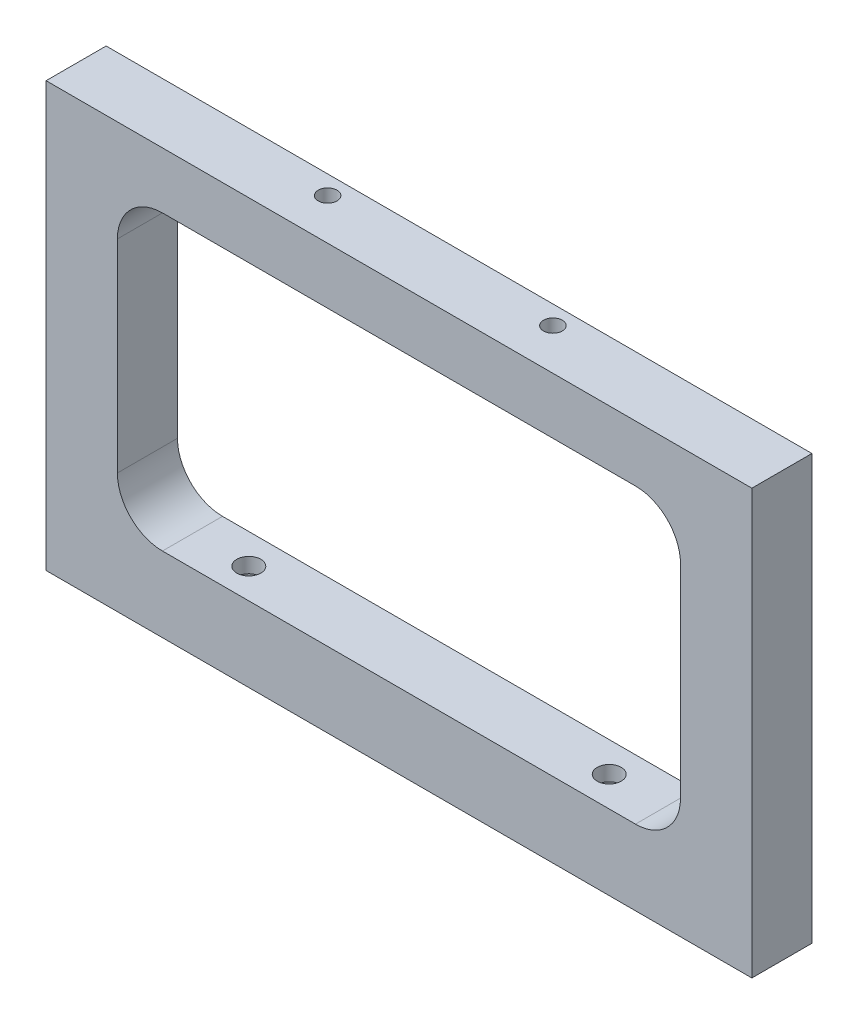
ISO-10303-21;
HEADER;
FILE_DESCRIPTION(('STEP AP214'),'2;1');
FILE_NAME('part.step','',(''),(''),'','','');
FILE_SCHEMA(('AUTOMOTIVE_DESIGN { 1 0 10303 214 1 1 1 1 }'));
ENDSEC;
DATA;
#1=APPLICATION_CONTEXT('core data for automotive mechanical design processes');
#2=APPLICATION_PROTOCOL_DEFINITION('international standard','automotive_design',2000,#1);
#3=PRODUCT_CONTEXT('',#1,'mechanical');
#4=PRODUCT('Part','Part','',(#3));
#5=PRODUCT_RELATED_PRODUCT_CATEGORY('part','',(#4));
#6=PRODUCT_DEFINITION_FORMATION('','',#4);
#7=PRODUCT_DEFINITION_CONTEXT('part definition',#1,'design');
#8=PRODUCT_DEFINITION('design','',#6,#7);
#9=PRODUCT_DEFINITION_SHAPE('','',#8);
#10=(LENGTH_UNIT() NAMED_UNIT(*) SI_UNIT(.MILLI.,.METRE.));
#11=(NAMED_UNIT(*) PLANE_ANGLE_UNIT() SI_UNIT($,.RADIAN.));
#12=(NAMED_UNIT(*) SI_UNIT($,.STERADIAN.) SOLID_ANGLE_UNIT());
#13=UNCERTAINTY_MEASURE_WITH_UNIT(LENGTH_MEASURE(1.E-05),#10,'distance_accuracy_value','');
#14=(GEOMETRIC_REPRESENTATION_CONTEXT(3) GLOBAL_UNCERTAINTY_ASSIGNED_CONTEXT((#13)) GLOBAL_UNIT_ASSIGNED_CONTEXT((#10,
#11,#12)) REPRESENTATION_CONTEXT('',''));
#15=CARTESIAN_POINT('',(0.,0.,0.));
#16=DIRECTION('',(0.,0.,1.));
#17=DIRECTION('',(1.,0.,0.));
#18=AXIS2_PLACEMENT_3D('',#15,#16,#17);
#19=CARTESIAN_POINT('',(0.,0.,0.));
#20=DIRECTION('',(0.,1.,0.));
#21=DIRECTION('',(1.,0.,0.));
#22=AXIS2_PLACEMENT_3D('',#19,#20,#21);
#23=PLANE('',#22);
#24=DIRECTION('',(-1.,0.,0.));
#25=VECTOR('',#24,1.);
#26=CARTESIAN_POINT('',(47.,0.,-4.));
#27=LINE('',#26,#25);
#28=CARTESIAN_POINT('',(47.,0.,-4.));
#29=VERTEX_POINT('',#28);
#30=CARTESIAN_POINT('',(-47.,0.,-4.));
#31=VERTEX_POINT('',#30);
#32=EDGE_CURVE('E213',#29,#31,#27,.T.);
#33=ORIENTED_EDGE('',*,*,#32,.F.);
#34=DIRECTION('',(0.,0.,-1.));
#35=VECTOR('',#34,1.);
#36=CARTESIAN_POINT('',(47.,0.,4.));
#37=LINE('',#36,#35);
#38=CARTESIAN_POINT('',(47.,0.,4.));
#39=VERTEX_POINT('',#38);
#40=EDGE_CURVE('E35',#39,#29,#37,.T.);
#41=ORIENTED_EDGE('',*,*,#40,.F.);
#42=DIRECTION('',(1.,0.,0.));
#43=VECTOR('',#42,1.);
#44=CARTESIAN_POINT('',(-47.,0.,4.));
#45=LINE('',#44,#43);
#46=CARTESIAN_POINT('',(-47.,0.,4.));
#47=VERTEX_POINT('',#46);
#48=EDGE_CURVE('E236',#47,#39,#45,.T.);
#49=ORIENTED_EDGE('',*,*,#48,.F.);
#50=DIRECTION('',(0.,0.,1.));
#51=VECTOR('',#50,1.);
#52=CARTESIAN_POINT('',(-47.,0.,-4.));
#53=LINE('',#52,#51);
#54=EDGE_CURVE('E26',#31,#47,#53,.T.);
#55=ORIENTED_EDGE('',*,*,#54,.F.);
#56=EDGE_LOOP('',(#33,#41,#49,#55));
#57=FACE_BOUND('',#56,.T.);
#58=CARTESIAN_POINT('',(24.,0.,0.));
#59=DIRECTION('',(0.,-1.,0.));
#60=DIRECTION('',(-1.,0.,0.));
#61=AXIS2_PLACEMENT_3D('',#58,#59,#60);
#62=CIRCLE('',#61,2.55);
#63=CARTESIAN_POINT('',(21.45,0.,0.));
#64=VERTEX_POINT('',#63);
#65=EDGE_CURVE('E176',#64,#64,#62,.T.);
#66=ORIENTED_EDGE('',*,*,#65,.F.);
#67=EDGE_LOOP('',(#66));
#68=FACE_BOUND('',#67,.T.);
#69=CARTESIAN_POINT('',(-24.,0.,0.));
#70=DIRECTION('',(0.,-1.,0.));
#71=DIRECTION('',(-1.,0.,0.));
#72=AXIS2_PLACEMENT_3D('',#69,#70,#71);
#73=CIRCLE('',#72,2.55);
#74=CARTESIAN_POINT('',(-26.55,0.,0.));
#75=VERTEX_POINT('',#74);
#76=EDGE_CURVE('E197',#75,#75,#73,.T.);
#77=ORIENTED_EDGE('',*,*,#76,.F.);
#78=EDGE_LOOP('',(#77));
#79=FACE_BOUND('',#78,.T.);
#80=ADVANCED_FACE('F16',(#57,#68,#79),#23,.F.);
#81=CARTESIAN_POINT('',(-47.,0.,-4.));
#82=DIRECTION('',(-1.,0.,0.));
#83=DIRECTION('',(0.,0.,1.));
#84=AXIS2_PLACEMENT_3D('',#81,#82,#83);
#85=PLANE('',#84);
#86=DIRECTION('',(0.,1.,0.));
#87=VECTOR('',#86,1.);
#88=CARTESIAN_POINT('',(-47.,0.,4.));
#89=LINE('',#88,#87);
#90=CARTESIAN_POINT('',(-47.,56.5,4.));
#91=VERTEX_POINT('',#90);
#92=EDGE_CURVE('E11',#47,#91,#89,.T.);
#93=ORIENTED_EDGE('',*,*,#92,.T.);
#94=DIRECTION('',(0.,0.,1.));
#95=VECTOR('',#94,1.);
#96=CARTESIAN_POINT('',(-47.,56.5,-4.));
#97=LINE('',#96,#95);
#98=CARTESIAN_POINT('',(-47.,56.5,-4.));
#99=VERTEX_POINT('',#98);
#100=EDGE_CURVE('E207',#99,#91,#97,.T.);
#101=ORIENTED_EDGE('',*,*,#100,.F.);
#102=DIRECTION('',(0.,1.,0.));
#103=VECTOR('',#102,1.);
#104=CARTESIAN_POINT('',(-47.,0.,-4.));
#105=LINE('',#104,#103);
#106=EDGE_CURVE('E210',#31,#99,#105,.T.);
#107=ORIENTED_EDGE('',*,*,#106,.F.);
#108=ORIENTED_EDGE('',*,*,#54,.T.);
#109=EDGE_LOOP('',(#93,#101,#107,#108));
#110=FACE_BOUND('',#109,.T.);
#111=ADVANCED_FACE('F274',(#110),#85,.T.);
#112=CARTESIAN_POINT('',(47.,0.,-4.));
#113=DIRECTION('',(0.,0.,-1.));
#114=DIRECTION('',(-1.,0.,0.));
#115=AXIS2_PLACEMENT_3D('',#112,#113,#114);
#116=PLANE('',#115);
#117=ORIENTED_EDGE('',*,*,#106,.T.);
#118=DIRECTION('',(-1.,0.,0.));
#119=VECTOR('',#118,1.);
#120=CARTESIAN_POINT('',(47.,56.5,-4.));
#121=LINE('',#120,#119);
#122=CARTESIAN_POINT('',(47.,56.5,-4.));
#123=VERTEX_POINT('',#122);
#124=EDGE_CURVE('E209',#123,#99,#121,.T.);
#125=ORIENTED_EDGE('',*,*,#124,.F.);
#126=DIRECTION('',(0.,1.,0.));
#127=VECTOR('',#126,1.);
#128=CARTESIAN_POINT('',(47.,0.,-4.));
#129=LINE('',#128,#127);
#130=EDGE_CURVE('E217',#29,#123,#129,.T.);
#131=ORIENTED_EDGE('',*,*,#130,.F.);
#132=ORIENTED_EDGE('',*,*,#32,.T.);
#133=EDGE_LOOP('',(#117,#125,#131,#132));
#134=FACE_BOUND('',#133,.T.);
#135=DIRECTION('',(1.,0.,0.));
#136=VECTOR('',#135,1.);
#137=CARTESIAN_POINT('',(-31.5,49.,-4.));
#138=LINE('',#137,#136);
#139=CARTESIAN_POINT('',(-31.5,49.,-4.));
#140=VERTEX_POINT('',#139);
#141=CARTESIAN_POINT('',(31.5,49.,-4.));
#142=VERTEX_POINT('',#141);
#143=EDGE_CURVE('E131',#140,#142,#138,.T.);
#144=ORIENTED_EDGE('',*,*,#143,.F.);
#145=CARTESIAN_POINT('',(-31.5,43.,-4.));
#146=DIRECTION('',(0.,0.,-1.));
#147=DIRECTION('',(-1.,0.,0.));
#148=AXIS2_PLACEMENT_3D('',#145,#146,#147);
#149=CIRCLE('',#148,6.);
#150=CARTESIAN_POINT('',(-37.5,43.,-4.));
#151=VERTEX_POINT('',#150);
#152=EDGE_CURVE('E172',#151,#140,#149,.T.);
#153=ORIENTED_EDGE('',*,*,#152,.F.);
#154=DIRECTION('',(0.,1.,0.));
#155=VECTOR('',#154,1.);
#156=CARTESIAN_POINT('',(-37.5,16.,-4.));
#157=LINE('',#156,#155);
#158=CARTESIAN_POINT('',(-37.5,16.,-4.));
#159=VERTEX_POINT('',#158);
#160=EDGE_CURVE('E168',#159,#151,#157,.T.);
#161=ORIENTED_EDGE('',*,*,#160,.F.);
#162=CARTESIAN_POINT('',(-31.5,16.,-4.));
#163=DIRECTION('',(0.,0.,-1.));
#164=DIRECTION('',(0.,-1.,0.));
#165=AXIS2_PLACEMENT_3D('',#162,#163,#164);
#166=CIRCLE('',#165,6.);
#167=CARTESIAN_POINT('',(-31.5,10.,-4.));
#168=VERTEX_POINT('',#167);
#169=EDGE_CURVE('E164',#168,#159,#166,.T.);
#170=ORIENTED_EDGE('',*,*,#169,.F.);
#171=DIRECTION('',(-1.,0.,0.));
#172=VECTOR('',#171,1.);
#173=CARTESIAN_POINT('',(31.5,10.,-4.));
#174=LINE('',#173,#172);
#175=CARTESIAN_POINT('',(31.5,10.,-4.));
#176=VERTEX_POINT('',#175);
#177=EDGE_CURVE('E154',#176,#168,#174,.T.);
#178=ORIENTED_EDGE('',*,*,#177,.F.);
#179=CARTESIAN_POINT('',(31.5,16.,-4.));
#180=DIRECTION('',(0.,0.,-1.));
#181=DIRECTION('',(1.,0.,0.));
#182=AXIS2_PLACEMENT_3D('',#179,#180,#181);
#183=CIRCLE('',#182,6.);
#184=CARTESIAN_POINT('',(37.5,16.,-4.));
#185=VERTEX_POINT('',#184);
#186=EDGE_CURVE('E150',#185,#176,#183,.T.);
#187=ORIENTED_EDGE('',*,*,#186,.F.);
#188=DIRECTION('',(0.,-1.,0.));
#189=VECTOR('',#188,1.);
#190=CARTESIAN_POINT('',(37.5,43.,-4.));
#191=LINE('',#190,#189);
#192=CARTESIAN_POINT('',(37.5,43.,-4.));
#193=VERTEX_POINT('',#192);
#194=EDGE_CURVE('E146',#193,#185,#191,.T.);
#195=ORIENTED_EDGE('',*,*,#194,.F.);
#196=CARTESIAN_POINT('',(31.5,43.,-4.));
#197=DIRECTION('',(0.,0.,-1.));
#198=DIRECTION('',(0.,1.,0.));
#199=AXIS2_PLACEMENT_3D('',#196,#197,#198);
#200=CIRCLE('',#199,6.);
#201=EDGE_CURVE('E144',#142,#193,#200,.T.);
#202=ORIENTED_EDGE('',*,*,#201,.F.);
#203=EDGE_LOOP('',(#144,#153,#161,#170,#178,#187,#195,#202));
#204=FACE_BOUND('',#203,.T.);
#205=ADVANCED_FACE('F280',(#134,#204),#116,.T.);
#206=CARTESIAN_POINT('',(47.,0.,4.));
#207=DIRECTION('',(1.,0.,0.));
#208=DIRECTION('',(0.,0.,-1.));
#209=AXIS2_PLACEMENT_3D('',#206,#207,#208);
#210=PLANE('',#209);
#211=ORIENTED_EDGE('',*,*,#130,.T.);
#212=DIRECTION('',(0.,0.,-1.));
#213=VECTOR('',#212,1.);
#214=CARTESIAN_POINT('',(47.,56.5,4.));
#215=LINE('',#214,#213);
#216=CARTESIAN_POINT('',(47.,56.5,4.));
#217=VERTEX_POINT('',#216);
#218=EDGE_CURVE('E216',#217,#123,#215,.T.);
#219=ORIENTED_EDGE('',*,*,#218,.F.);
#220=DIRECTION('',(0.,1.,0.));
#221=VECTOR('',#220,1.);
#222=CARTESIAN_POINT('',(47.,0.,4.));
#223=LINE('',#222,#221);
#224=EDGE_CURVE('E233',#39,#217,#223,.T.);
#225=ORIENTED_EDGE('',*,*,#224,.F.);
#226=ORIENTED_EDGE('',*,*,#40,.T.);
#227=EDGE_LOOP('',(#211,#219,#225,#226));
#228=FACE_BOUND('',#227,.T.);
#229=ADVANCED_FACE('F287',(#228),#210,.T.);
#230=CARTESIAN_POINT('',(-47.,0.,4.));
#231=DIRECTION('',(0.,0.,1.));
#232=DIRECTION('',(1.,0.,0.));
#233=AXIS2_PLACEMENT_3D('',#230,#231,#232);
#234=PLANE('',#233);
#235=ORIENTED_EDGE('',*,*,#224,.T.);
#236=DIRECTION('',(1.,0.,0.));
#237=VECTOR('',#236,1.);
#238=CARTESIAN_POINT('',(-47.,56.5,4.));
#239=LINE('',#238,#237);
#240=EDGE_CURVE('E120',#91,#217,#239,.T.);
#241=ORIENTED_EDGE('',*,*,#240,.F.);
#242=ORIENTED_EDGE('',*,*,#92,.F.);
#243=ORIENTED_EDGE('',*,*,#48,.T.);
#244=EDGE_LOOP('',(#235,#241,#242,#243));
#245=FACE_BOUND('',#244,.T.);
#246=DIRECTION('',(0.,-1.,0.));
#247=VECTOR('',#246,1.);
#248=CARTESIAN_POINT('',(37.5,43.,4.));
#249=LINE('',#248,#247);
#250=CARTESIAN_POINT('',(37.5,43.,4.));
#251=VERTEX_POINT('',#250);
#252=CARTESIAN_POINT('',(37.5,16.,4.));
#253=VERTEX_POINT('',#252);
#254=EDGE_CURVE('E239',#251,#253,#249,.T.);
#255=ORIENTED_EDGE('',*,*,#254,.T.);
#256=CARTESIAN_POINT('',(31.5,16.,4.));
#257=DIRECTION('',(0.,0.,-1.));
#258=DIRECTION('',(1.,0.,0.));
#259=AXIS2_PLACEMENT_3D('',#256,#257,#258);
#260=CIRCLE('',#259,6.);
#261=CARTESIAN_POINT('',(31.5,10.,4.));
#262=VERTEX_POINT('',#261);
#263=EDGE_CURVE('E241',#253,#262,#260,.T.);
#264=ORIENTED_EDGE('',*,*,#263,.T.);
#265=DIRECTION('',(-1.,0.,0.));
#266=VECTOR('',#265,1.);
#267=CARTESIAN_POINT('',(31.5,10.,4.));
#268=LINE('',#267,#266);
#269=CARTESIAN_POINT('',(-31.5,10.,4.));
#270=VERTEX_POINT('',#269);
#271=EDGE_CURVE('E244',#262,#270,#268,.T.);
#272=ORIENTED_EDGE('',*,*,#271,.T.);
#273=CARTESIAN_POINT('',(-31.5,16.,4.));
#274=DIRECTION('',(0.,0.,-1.));
#275=DIRECTION('',(0.,-1.,0.));
#276=AXIS2_PLACEMENT_3D('',#273,#274,#275);
#277=CIRCLE('',#276,6.);
#278=CARTESIAN_POINT('',(-37.5,16.,4.));
#279=VERTEX_POINT('',#278);
#280=EDGE_CURVE('E247',#270,#279,#277,.T.);
#281=ORIENTED_EDGE('',*,*,#280,.T.);
#282=DIRECTION('',(0.,1.,0.));
#283=VECTOR('',#282,1.);
#284=CARTESIAN_POINT('',(-37.5,16.,4.));
#285=LINE('',#284,#283);
#286=CARTESIAN_POINT('',(-37.5,43.,4.));
#287=VERTEX_POINT('',#286);
#288=EDGE_CURVE('E250',#279,#287,#285,.T.);
#289=ORIENTED_EDGE('',*,*,#288,.T.);
#290=CARTESIAN_POINT('',(-31.5,43.,4.));
#291=DIRECTION('',(0.,0.,-1.));
#292=DIRECTION('',(-1.,0.,0.));
#293=AXIS2_PLACEMENT_3D('',#290,#291,#292);
#294=CIRCLE('',#293,6.);
#295=CARTESIAN_POINT('',(-31.5,49.,4.));
#296=VERTEX_POINT('',#295);
#297=EDGE_CURVE('E124',#287,#296,#294,.T.);
#298=ORIENTED_EDGE('',*,*,#297,.T.);
#299=DIRECTION('',(1.,0.,0.));
#300=VECTOR('',#299,1.);
#301=CARTESIAN_POINT('',(-31.5,49.,4.));
#302=LINE('',#301,#300);
#303=CARTESIAN_POINT('',(31.5,49.,4.));
#304=VERTEX_POINT('',#303);
#305=EDGE_CURVE('E105',#296,#304,#302,.T.);
#306=ORIENTED_EDGE('',*,*,#305,.T.);
#307=CARTESIAN_POINT('',(31.5,43.,4.));
#308=DIRECTION('',(0.,0.,-1.));
#309=DIRECTION('',(0.,1.,0.));
#310=AXIS2_PLACEMENT_3D('',#307,#308,#309);
#311=CIRCLE('',#310,6.);
#312=EDGE_CURVE('E111',#304,#251,#311,.T.);
#313=ORIENTED_EDGE('',*,*,#312,.T.);
#314=EDGE_LOOP('',(#255,#264,#272,#281,#289,#298,#306,#313));
#315=FACE_BOUND('',#314,.T.);
#316=ADVANCED_FACE('F122',(#245,#315),#234,.T.);
#317=CARTESIAN_POINT('',(0.,56.5,0.));
#318=DIRECTION('',(0.,1.,0.));
#319=DIRECTION('',(1.,0.,0.));
#320=AXIS2_PLACEMENT_3D('',#317,#318,#319);
#321=PLANE('',#320);
#322=ORIENTED_EDGE('',*,*,#240,.T.);
#323=ORIENTED_EDGE('',*,*,#218,.T.);
#324=ORIENTED_EDGE('',*,*,#124,.T.);
#325=ORIENTED_EDGE('',*,*,#100,.T.);
#326=EDGE_LOOP('',(#322,#323,#324,#325));
#327=FACE_BOUND('',#326,.T.);
#328=CARTESIAN_POINT('',(-15.,56.5,-1.5));
#329=DIRECTION('',(0.,1.,0.));
#330=DIRECTION('',(-1.,0.,0.));
#331=AXIS2_PLACEMENT_3D('',#328,#329,#330);
#332=CIRCLE('',#331,1.25);
#333=CARTESIAN_POINT('',(-16.25,56.5,-1.5));
#334=VERTEX_POINT('',#333);
#335=EDGE_CURVE('E134',#334,#334,#332,.T.);
#336=ORIENTED_EDGE('',*,*,#335,.F.);
#337=EDGE_LOOP('',(#336));
#338=FACE_BOUND('',#337,.T.);
#339=CARTESIAN_POINT('',(15.,56.5,-1.5));
#340=DIRECTION('',(0.,1.,0.));
#341=DIRECTION('',(-1.,0.,0.));
#342=AXIS2_PLACEMENT_3D('',#339,#340,#341);
#343=CIRCLE('',#342,1.25);
#344=CARTESIAN_POINT('',(13.75,56.5,-1.5));
#345=VERTEX_POINT('',#344);
#346=EDGE_CURVE('E199',#345,#345,#343,.T.);
#347=ORIENTED_EDGE('',*,*,#346,.F.);
#348=EDGE_LOOP('',(#347));
#349=FACE_BOUND('',#348,.T.);
#350=ADVANCED_FACE('F258',(#327,#338,#349),#321,.T.);
#351=CARTESIAN_POINT('',(-15.,62.8075,-1.5));
#352=DIRECTION('',(0.,-1.,0.));
#353=DIRECTION('',(-1.,0.,0.));
#354=AXIS2_PLACEMENT_3D('',#351,#352,#353);
#355=CYLINDRICAL_SURFACE('',#354,1.25);
#356=CARTESIAN_POINT('',(-15.,49.,-1.5));
#357=DIRECTION('',(0.,1.,0.));
#358=DIRECTION('',(1.,0.,0.));
#359=AXIS2_PLACEMENT_3D('',#356,#357,#358);
#360=CIRCLE('',#359,1.25);
#361=CARTESIAN_POINT('',(-13.75,49.,-1.5));
#362=VERTEX_POINT('',#361);
#363=EDGE_CURVE('E132',#362,#362,#360,.T.);
#364=ORIENTED_EDGE('',*,*,#363,.F.);
#365=EDGE_LOOP('',(#364));
#366=FACE_BOUND('',#365,.T.);
#367=ORIENTED_EDGE('',*,*,#335,.T.);
#368=EDGE_LOOP('',(#367));
#369=FACE_BOUND('',#368,.T.);
#370=ADVANCED_FACE('F256',(#366,#369),#355,.F.);
#371=CARTESIAN_POINT('',(-31.5,49.,-4.));
#372=DIRECTION('',(0.,1.,0.));
#373=DIRECTION('',(1.,0.,0.));
#374=AXIS2_PLACEMENT_3D('',#371,#372,#373);
#375=PLANE('',#374);
#376=DIRECTION('',(0.,0.,1.));
#377=VECTOR('',#376,1.);
#378=CARTESIAN_POINT('',(-31.5,49.,-4.));
#379=LINE('',#378,#377);
#380=EDGE_CURVE('E141',#140,#296,#379,.T.);
#381=ORIENTED_EDGE('',*,*,#380,.F.);
#382=ORIENTED_EDGE('',*,*,#143,.T.);
#383=DIRECTION('',(0.,0.,1.));
#384=VECTOR('',#383,1.);
#385=CARTESIAN_POINT('',(31.5,49.,-4.));
#386=LINE('',#385,#384);
#387=EDGE_CURVE('E114',#142,#304,#386,.T.);
#388=ORIENTED_EDGE('',*,*,#387,.T.);
#389=ORIENTED_EDGE('',*,*,#305,.F.);
#390=EDGE_LOOP('',(#381,#382,#388,#389));
#391=FACE_BOUND('',#390,.T.);
#392=ORIENTED_EDGE('',*,*,#363,.T.);
#393=EDGE_LOOP('',(#392));
#394=FACE_BOUND('',#393,.T.);
#395=CARTESIAN_POINT('',(15.,49.,-1.5));
#396=DIRECTION('',(0.,1.,0.));
#397=DIRECTION('',(-1.,0.,0.));
#398=AXIS2_PLACEMENT_3D('',#395,#396,#397);
#399=CIRCLE('',#398,1.25);
#400=CARTESIAN_POINT('',(13.75,49.,-1.5));
#401=VERTEX_POINT('',#400);
#402=EDGE_CURVE('E137',#401,#401,#399,.T.);
#403=ORIENTED_EDGE('',*,*,#402,.T.);
#404=EDGE_LOOP('',(#403));
#405=FACE_BOUND('',#404,.T.);
#406=ADVANCED_FACE('F128',(#391,#394,#405),#375,.F.);
#407=CARTESIAN_POINT('',(31.5,43.,-4.));
#408=DIRECTION('',(0.,0.,-1.));
#409=DIRECTION('',(-1.,0.,0.));
#410=AXIS2_PLACEMENT_3D('',#407,#408,#409);
#411=CYLINDRICAL_SURFACE('',#410,6.);
#412=ORIENTED_EDGE('',*,*,#387,.F.);
#413=ORIENTED_EDGE('',*,*,#201,.T.);
#414=DIRECTION('',(0.,0.,1.));
#415=VECTOR('',#414,1.);
#416=CARTESIAN_POINT('',(37.5,43.,-4.));
#417=LINE('',#416,#415);
#418=EDGE_CURVE('E116',#193,#251,#417,.T.);
#419=ORIENTED_EDGE('',*,*,#418,.T.);
#420=ORIENTED_EDGE('',*,*,#312,.F.);
#421=EDGE_LOOP('',(#412,#413,#419,#420));
#422=FACE_BOUND('',#421,.T.);
#423=ADVANCED_FACE('F112',(#422),#411,.F.);
#424=CARTESIAN_POINT('',(37.5,43.,-4.));
#425=DIRECTION('',(1.,0.,0.));
#426=DIRECTION('',(0.,-1.,0.));
#427=AXIS2_PLACEMENT_3D('',#424,#425,#426);
#428=PLANE('',#427);
#429=ORIENTED_EDGE('',*,*,#418,.F.);
#430=ORIENTED_EDGE('',*,*,#194,.T.);
#431=DIRECTION('',(0.,0.,1.));
#432=VECTOR('',#431,1.);
#433=CARTESIAN_POINT('',(37.5,16.,-4.));
#434=LINE('',#433,#432);
#435=EDGE_CURVE('E147',#185,#253,#434,.T.);
#436=ORIENTED_EDGE('',*,*,#435,.T.);
#437=ORIENTED_EDGE('',*,*,#254,.F.);
#438=EDGE_LOOP('',(#429,#430,#436,#437));
#439=FACE_BOUND('',#438,.T.);
#440=ADVANCED_FACE('F301',(#439),#428,.F.);
#441=CARTESIAN_POINT('',(31.5,16.,-4.));
#442=DIRECTION('',(0.,0.,-1.));
#443=DIRECTION('',(-1.,0.,0.));
#444=AXIS2_PLACEMENT_3D('',#441,#442,#443);
#445=CYLINDRICAL_SURFACE('',#444,6.);
#446=ORIENTED_EDGE('',*,*,#435,.F.);
#447=ORIENTED_EDGE('',*,*,#186,.T.);
#448=DIRECTION('',(0.,0.,1.));
#449=VECTOR('',#448,1.);
#450=CARTESIAN_POINT('',(31.5,10.,-4.));
#451=LINE('',#450,#449);
#452=EDGE_CURVE('E151',#176,#262,#451,.T.);
#453=ORIENTED_EDGE('',*,*,#452,.T.);
#454=ORIENTED_EDGE('',*,*,#263,.F.);
#455=EDGE_LOOP('',(#446,#447,#453,#454));
#456=FACE_BOUND('',#455,.T.);
#457=ADVANCED_FACE('F304',(#456),#445,.F.);
#458=CARTESIAN_POINT('',(31.5,10.,-4.));
#459=DIRECTION('',(0.,-1.,0.));
#460=DIRECTION('',(-1.,0.,0.));
#461=AXIS2_PLACEMENT_3D('',#458,#459,#460);
#462=PLANE('',#461);
#463=ORIENTED_EDGE('',*,*,#452,.F.);
#464=ORIENTED_EDGE('',*,*,#177,.T.);
#465=DIRECTION('',(0.,0.,1.));
#466=VECTOR('',#465,1.);
#467=CARTESIAN_POINT('',(-31.5,10.,-4.));
#468=LINE('',#467,#466);
#469=EDGE_CURVE('E155',#168,#270,#468,.T.);
#470=ORIENTED_EDGE('',*,*,#469,.T.);
#471=ORIENTED_EDGE('',*,*,#271,.F.);
#472=EDGE_LOOP('',(#463,#464,#470,#471));
#473=FACE_BOUND('',#472,.T.);
#474=CARTESIAN_POINT('',(-24.,10.,0.));
#475=DIRECTION('',(0.,-1.,0.));
#476=DIRECTION('',(1.,0.,0.));
#477=AXIS2_PLACEMENT_3D('',#474,#475,#476);
#478=CIRCLE('',#477,1.6);
#479=CARTESIAN_POINT('',(-22.4,10.,0.));
#480=VERTEX_POINT('',#479);
#481=EDGE_CURVE('E158',#480,#480,#478,.T.);
#482=ORIENTED_EDGE('',*,*,#481,.T.);
#483=EDGE_LOOP('',(#482));
#484=FACE_BOUND('',#483,.T.);
#485=CARTESIAN_POINT('',(24.,10.,0.));
#486=DIRECTION('',(0.,-1.,0.));
#487=DIRECTION('',(1.,0.,0.));
#488=AXIS2_PLACEMENT_3D('',#485,#486,#487);
#489=CIRCLE('',#488,1.6);
#490=CARTESIAN_POINT('',(25.6,10.,0.));
#491=VERTEX_POINT('',#490);
#492=EDGE_CURVE('E161',#491,#491,#489,.T.);
#493=ORIENTED_EDGE('',*,*,#492,.T.);
#494=EDGE_LOOP('',(#493));
#495=FACE_BOUND('',#494,.T.);
#496=ADVANCED_FACE('F308',(#473,#484,#495),#462,.F.);
#497=CARTESIAN_POINT('',(-31.5,16.,-4.));
#498=DIRECTION('',(0.,0.,-1.));
#499=DIRECTION('',(-1.,0.,0.));
#500=AXIS2_PLACEMENT_3D('',#497,#498,#499);
#501=CYLINDRICAL_SURFACE('',#500,6.);
#502=ORIENTED_EDGE('',*,*,#469,.F.);
#503=ORIENTED_EDGE('',*,*,#169,.T.);
#504=DIRECTION('',(0.,0.,1.));
#505=VECTOR('',#504,1.);
#506=CARTESIAN_POINT('',(-37.5,16.,-4.));
#507=LINE('',#506,#505);
#508=EDGE_CURVE('E165',#159,#279,#507,.T.);
#509=ORIENTED_EDGE('',*,*,#508,.T.);
#510=ORIENTED_EDGE('',*,*,#280,.F.);
#511=EDGE_LOOP('',(#502,#503,#509,#510));
#512=FACE_BOUND('',#511,.T.);
#513=ADVANCED_FACE('F312',(#512),#501,.F.);
#514=CARTESIAN_POINT('',(-37.5,16.,-4.));
#515=DIRECTION('',(-1.,0.,0.));
#516=DIRECTION('',(0.,1.,0.));
#517=AXIS2_PLACEMENT_3D('',#514,#515,#516);
#518=PLANE('',#517);
#519=ORIENTED_EDGE('',*,*,#508,.F.);
#520=ORIENTED_EDGE('',*,*,#160,.T.);
#521=DIRECTION('',(0.,0.,1.));
#522=VECTOR('',#521,1.);
#523=CARTESIAN_POINT('',(-37.5,43.,-4.));
#524=LINE('',#523,#522);
#525=EDGE_CURVE('E169',#151,#287,#524,.T.);
#526=ORIENTED_EDGE('',*,*,#525,.T.);
#527=ORIENTED_EDGE('',*,*,#288,.F.);
#528=EDGE_LOOP('',(#519,#520,#526,#527));
#529=FACE_BOUND('',#528,.T.);
#530=ADVANCED_FACE('F316',(#529),#518,.F.);
#531=CARTESIAN_POINT('',(-31.5,43.,-4.));
#532=DIRECTION('',(0.,0.,-1.));
#533=DIRECTION('',(-1.,0.,0.));
#534=AXIS2_PLACEMENT_3D('',#531,#532,#533);
#535=CYLINDRICAL_SURFACE('',#534,6.);
#536=ORIENTED_EDGE('',*,*,#525,.F.);
#537=ORIENTED_EDGE('',*,*,#152,.T.);
#538=ORIENTED_EDGE('',*,*,#380,.T.);
#539=ORIENTED_EDGE('',*,*,#297,.F.);
#540=EDGE_LOOP('',(#536,#537,#538,#539));
#541=FACE_BOUND('',#540,.T.);
#542=ADVANCED_FACE('F320',(#541),#535,.F.);
#543=CARTESIAN_POINT('',(-24.,-6.4325,0.));
#544=DIRECTION('',(0.,1.,0.));
#545=DIRECTION('',(1.,0.,0.));
#546=AXIS2_PLACEMENT_3D('',#543,#544,#545);
#547=CYLINDRICAL_SURFACE('',#546,1.6);
#548=ORIENTED_EDGE('',*,*,#481,.F.);
#549=EDGE_LOOP('',(#548));
#550=FACE_BOUND('',#549,.T.);
#551=CARTESIAN_POINT('',(-24.,8.,0.));
#552=DIRECTION('',(0.,1.,0.));
#553=DIRECTION('',(1.,0.,0.));
#554=AXIS2_PLACEMENT_3D('',#551,#552,#553);
#555=CIRCLE('',#554,1.6);
#556=CARTESIAN_POINT('',(-22.4,8.,0.));
#557=VERTEX_POINT('',#556);
#558=EDGE_CURVE('E173',#557,#557,#555,.T.);
#559=ORIENTED_EDGE('',*,*,#558,.F.);
#560=EDGE_LOOP('',(#559));
#561=FACE_BOUND('',#560,.T.);
#562=ADVANCED_FACE('F324',(#550,#561),#547,.F.);
#563=CARTESIAN_POINT('',(0.,8.,0.));
#564=DIRECTION('',(0.,-1.,0.));
#565=DIRECTION('',(1.,0.,0.));
#566=AXIS2_PLACEMENT_3D('',#563,#564,#565);
#567=PLANE('',#566);
#568=CARTESIAN_POINT('',(24.,8.,0.));
#569=DIRECTION('',(0.,-1.,0.));
#570=DIRECTION('',(-1.,0.,0.));
#571=AXIS2_PLACEMENT_3D('',#568,#569,#570);
#572=CIRCLE('',#571,2.55);
#573=CARTESIAN_POINT('',(21.45,8.,0.));
#574=VERTEX_POINT('',#573);
#575=EDGE_CURVE('E177',#574,#574,#572,.T.);
#576=ORIENTED_EDGE('',*,*,#575,.T.);
#577=EDGE_LOOP('',(#576));
#578=FACE_BOUND('',#577,.T.);
#579=CARTESIAN_POINT('',(24.,8.,0.));
#580=DIRECTION('',(0.,1.,0.));
#581=DIRECTION('',(-1.,0.,0.));
#582=AXIS2_PLACEMENT_3D('',#579,#580,#581);
#583=CIRCLE('',#582,1.6);
#584=CARTESIAN_POINT('',(22.4,8.,0.));
#585=VERTEX_POINT('',#584);
#586=EDGE_CURVE('E179',#585,#585,#583,.T.);
#587=ORIENTED_EDGE('',*,*,#586,.T.);
#588=EDGE_LOOP('',(#587));
#589=FACE_BOUND('',#588,.T.);
#590=ADVANCED_FACE('F328',(#578,#589),#567,.T.);
#591=CARTESIAN_POINT('',(0.,8.,0.));
#592=DIRECTION('',(0.,-1.,0.));
#593=DIRECTION('',(1.,0.,0.));
#594=AXIS2_PLACEMENT_3D('',#591,#592,#593);
#595=PLANE('',#594);
#596=CARTESIAN_POINT('',(-24.,8.,0.));
#597=DIRECTION('',(0.,-1.,0.));
#598=DIRECTION('',(-1.,0.,0.));
#599=AXIS2_PLACEMENT_3D('',#596,#597,#598);
#600=CIRCLE('',#599,2.55);
#601=CARTESIAN_POINT('',(-26.55,8.,0.));
#602=VERTEX_POINT('',#601);
#603=EDGE_CURVE('E20',#602,#602,#600,.T.);
#604=ORIENTED_EDGE('',*,*,#603,.T.);
#605=EDGE_LOOP('',(#604));
#606=FACE_BOUND('',#605,.T.);
#607=ORIENTED_EDGE('',*,*,#558,.T.);
#608=EDGE_LOOP('',(#607));
#609=FACE_BOUND('',#608,.T.);
#610=ADVANCED_FACE('F186',(#606,#609),#595,.T.);
#611=CARTESIAN_POINT('',(24.,0.,0.));
#612=DIRECTION('',(0.,-1.,0.));
#613=DIRECTION('',(1.,0.,0.));
#614=AXIS2_PLACEMENT_3D('',#611,#612,#613);
#615=CYLINDRICAL_SURFACE('',#614,2.55);
#616=ORIENTED_EDGE('',*,*,#575,.F.);
#617=EDGE_LOOP('',(#616));
#618=FACE_BOUND('',#617,.T.);
#619=ORIENTED_EDGE('',*,*,#65,.T.);
#620=EDGE_LOOP('',(#619));
#621=FACE_BOUND('',#620,.T.);
#622=ADVANCED_FACE('F193',(#618,#621),#615,.F.);
#623=CARTESIAN_POINT('',(-24.,0.,0.));
#624=DIRECTION('',(0.,-1.,0.));
#625=DIRECTION('',(1.,0.,0.));
#626=AXIS2_PLACEMENT_3D('',#623,#624,#625);
#627=CYLINDRICAL_SURFACE('',#626,2.55);
#628=ORIENTED_EDGE('',*,*,#603,.F.);
#629=EDGE_LOOP('',(#628));
#630=FACE_BOUND('',#629,.T.);
#631=ORIENTED_EDGE('',*,*,#76,.T.);
#632=EDGE_LOOP('',(#631));
#633=FACE_BOUND('',#632,.T.);
#634=ADVANCED_FACE('F189',(#630,#633),#627,.F.);
#635=CARTESIAN_POINT('',(24.,-6.4325,0.));
#636=DIRECTION('',(0.,1.,0.));
#637=DIRECTION('',(1.,0.,0.));
#638=AXIS2_PLACEMENT_3D('',#635,#636,#637);
#639=CYLINDRICAL_SURFACE('',#638,1.6);
#640=ORIENTED_EDGE('',*,*,#492,.F.);
#641=EDGE_LOOP('',(#640));
#642=FACE_BOUND('',#641,.T.);
#643=ORIENTED_EDGE('',*,*,#586,.F.);
#644=EDGE_LOOP('',(#643));
#645=FACE_BOUND('',#644,.T.);
#646=ADVANCED_FACE('F192',(#642,#645),#639,.F.);
#647=CARTESIAN_POINT('',(15.,62.8075,-1.5));
#648=DIRECTION('',(0.,-1.,0.));
#649=DIRECTION('',(-1.,0.,0.));
#650=AXIS2_PLACEMENT_3D('',#647,#648,#649);
#651=CYLINDRICAL_SURFACE('',#650,1.25);
#652=ORIENTED_EDGE('',*,*,#402,.F.);
#653=EDGE_LOOP('',(#652));
#654=FACE_BOUND('',#653,.T.);
#655=ORIENTED_EDGE('',*,*,#346,.T.);
#656=EDGE_LOOP('',(#655));
#657=FACE_BOUND('',#656,.T.);
#658=ADVANCED_FACE('F18',(#654,#657),#651,.F.);
#659=CLOSED_SHELL('',(#80,#111,#205,#229,#316,#350,#370,#406,#423,#440,#457,#496,#513,#530,#542,
#562,#590,#610,#622,#634,#646,#658));
#660=MANIFOLD_SOLID_BREP('B1',#659);
#661=ADVANCED_BREP_SHAPE_REPRESENTATION('',(#18,#660),#14);
#662=SHAPE_DEFINITION_REPRESENTATION(#9,#661);
ENDSEC;
END-ISO-10303-21;
